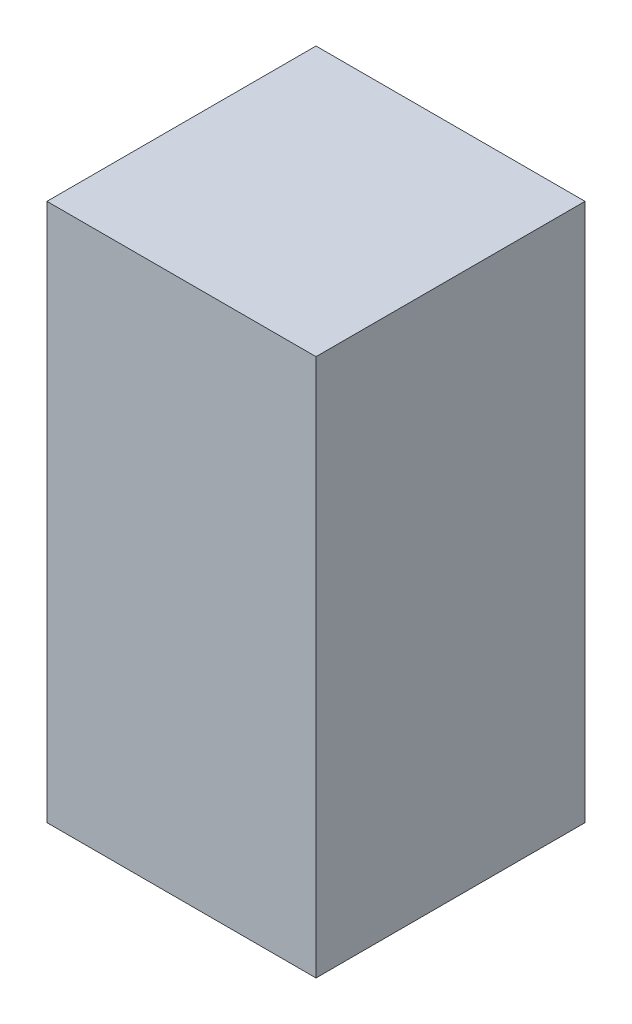
ISO-10303-21;
HEADER;
FILE_DESCRIPTION(('STEP AP214'),'2;1');
FILE_NAME('part.step','',(''),(''),'','','');
FILE_SCHEMA(('AUTOMOTIVE_DESIGN { 1 0 10303 214 1 1 1 1 }'));
ENDSEC;
DATA;
#1=APPLICATION_CONTEXT('core data for automotive mechanical design processes');
#2=APPLICATION_PROTOCOL_DEFINITION('international standard','automotive_design',2000,#1);
#3=PRODUCT_CONTEXT('',#1,'mechanical');
#4=PRODUCT('Part','Part','',(#3));
#5=PRODUCT_RELATED_PRODUCT_CATEGORY('part','',(#4));
#6=PRODUCT_DEFINITION_FORMATION('','',#4);
#7=PRODUCT_DEFINITION_CONTEXT('part definition',#1,'design');
#8=PRODUCT_DEFINITION('design','',#6,#7);
#9=PRODUCT_DEFINITION_SHAPE('','',#8);
#10=(LENGTH_UNIT() NAMED_UNIT(*) SI_UNIT(.MILLI.,.METRE.));
#11=(NAMED_UNIT(*) PLANE_ANGLE_UNIT() SI_UNIT($,.RADIAN.));
#12=(NAMED_UNIT(*) SI_UNIT($,.STERADIAN.) SOLID_ANGLE_UNIT());
#13=UNCERTAINTY_MEASURE_WITH_UNIT(LENGTH_MEASURE(1.E-05),#10,'distance_accuracy_value','');
#14=(GEOMETRIC_REPRESENTATION_CONTEXT(3) GLOBAL_UNCERTAINTY_ASSIGNED_CONTEXT((#13)) GLOBAL_UNIT_ASSIGNED_CONTEXT((#10,
#11,#12)) REPRESENTATION_CONTEXT('',''));
#15=CARTESIAN_POINT('',(0.,0.,0.));
#16=DIRECTION('',(0.,0.,1.));
#17=DIRECTION('',(1.,0.,0.));
#18=AXIS2_PLACEMENT_3D('',#15,#16,#17);
#19=CARTESIAN_POINT('',(50.,200.,50.));
#20=DIRECTION('',(-1.,0.,0.));
#21=DIRECTION('',(0.,0.,1.));
#22=AXIS2_PLACEMENT_3D('',#19,#20,#21);
#23=PLANE('',#22);
#24=DIRECTION('',(0.,0.,-1.));
#25=VECTOR('',#24,1.);
#26=CARTESIAN_POINT('',(50.,0.,50.));
#27=LINE('',#26,#25);
#28=CARTESIAN_POINT('',(50.,0.,50.));
#29=VERTEX_POINT('',#28);
#30=CARTESIAN_POINT('',(50.,0.,-50.));
#31=VERTEX_POINT('',#30);
#32=EDGE_CURVE('E97',#29,#31,#27,.T.);
#33=ORIENTED_EDGE('',*,*,#32,.T.);
#34=DIRECTION('',(0.,-1.,0.));
#35=VECTOR('',#34,1.);
#36=CARTESIAN_POINT('',(50.,200.,-50.));
#37=LINE('',#36,#35);
#38=CARTESIAN_POINT('',(50.,200.,-50.));
#39=VERTEX_POINT('',#38);
#40=EDGE_CURVE('E11',#39,#31,#37,.T.);
#41=ORIENTED_EDGE('',*,*,#40,.F.);
#42=DIRECTION('',(0.,0.,-1.));
#43=VECTOR('',#42,1.);
#44=CARTESIAN_POINT('',(50.,200.,50.));
#45=LINE('',#44,#43);
#46=CARTESIAN_POINT('',(50.,200.,50.));
#47=VERTEX_POINT('',#46);
#48=EDGE_CURVE('E85',#47,#39,#45,.T.);
#49=ORIENTED_EDGE('',*,*,#48,.F.);
#50=DIRECTION('',(0.,-1.,0.));
#51=VECTOR('',#50,1.);
#52=CARTESIAN_POINT('',(50.,200.,50.));
#53=LINE('',#52,#51);
#54=EDGE_CURVE('E93',#47,#29,#53,.T.);
#55=ORIENTED_EDGE('',*,*,#54,.T.);
#56=EDGE_LOOP('',(#33,#41,#49,#55));
#57=FACE_BOUND('',#56,.T.);
#58=ADVANCED_FACE('F34',(#57),#23,.F.);
#59=CARTESIAN_POINT('',(-50.,200.,-50.));
#60=DIRECTION('',(0.,0.,1.));
#61=DIRECTION('',(1.,0.,0.));
#62=AXIS2_PLACEMENT_3D('',#59,#60,#61);
#63=PLANE('',#62);
#64=DIRECTION('',(-1.,0.,0.));
#65=VECTOR('',#64,1.);
#66=CARTESIAN_POINT('',(-50.,0.,-50.));
#67=LINE('',#66,#65);
#68=CARTESIAN_POINT('',(-50.,0.,-50.));
#69=VERTEX_POINT('',#68);
#70=EDGE_CURVE('E89',#31,#69,#67,.T.);
#71=ORIENTED_EDGE('',*,*,#70,.T.);
#72=DIRECTION('',(0.,-1.,0.));
#73=VECTOR('',#72,1.);
#74=CARTESIAN_POINT('',(-50.,200.,-50.));
#75=LINE('',#74,#73);
#76=CARTESIAN_POINT('',(-50.,200.,-50.));
#77=VERTEX_POINT('',#76);
#78=EDGE_CURVE('E42',#77,#69,#75,.T.);
#79=ORIENTED_EDGE('',*,*,#78,.F.);
#80=DIRECTION('',(-1.,0.,0.));
#81=VECTOR('',#80,1.);
#82=CARTESIAN_POINT('',(-50.,200.,-50.));
#83=LINE('',#82,#81);
#84=EDGE_CURVE('E80',#39,#77,#83,.T.);
#85=ORIENTED_EDGE('',*,*,#84,.F.);
#86=ORIENTED_EDGE('',*,*,#40,.T.);
#87=EDGE_LOOP('',(#71,#79,#85,#86));
#88=FACE_BOUND('',#87,.T.);
#89=ADVANCED_FACE('F88',(#88),#63,.F.);
#90=CARTESIAN_POINT('',(-50.,200.,50.));
#91=DIRECTION('',(1.,0.,0.));
#92=DIRECTION('',(0.,0.,-1.));
#93=AXIS2_PLACEMENT_3D('',#90,#91,#92);
#94=PLANE('',#93);
#95=DIRECTION('',(0.,0.,1.));
#96=VECTOR('',#95,1.);
#97=CARTESIAN_POINT('',(-50.,0.,50.));
#98=LINE('',#97,#96);
#99=CARTESIAN_POINT('',(-50.,0.,50.));
#100=VERTEX_POINT('',#99);
#101=EDGE_CURVE('E67',#69,#100,#98,.T.);
#102=ORIENTED_EDGE('',*,*,#101,.T.);
#103=DIRECTION('',(0.,-1.,0.));
#104=VECTOR('',#103,1.);
#105=CARTESIAN_POINT('',(-50.,200.,50.));
#106=LINE('',#105,#104);
#107=CARTESIAN_POINT('',(-50.,200.,50.));
#108=VERTEX_POINT('',#107);
#109=EDGE_CURVE('E90',#108,#100,#106,.T.);
#110=ORIENTED_EDGE('',*,*,#109,.F.);
#111=DIRECTION('',(0.,0.,1.));
#112=VECTOR('',#111,1.);
#113=CARTESIAN_POINT('',(-50.,200.,50.));
#114=LINE('',#113,#112);
#115=EDGE_CURVE('E83',#77,#108,#114,.T.);
#116=ORIENTED_EDGE('',*,*,#115,.F.);
#117=ORIENTED_EDGE('',*,*,#78,.T.);
#118=EDGE_LOOP('',(#102,#110,#116,#117));
#119=FACE_BOUND('',#118,.T.);
#120=ADVANCED_FACE('F91',(#119),#94,.F.);
#121=CARTESIAN_POINT('',(-50.,200.,50.));
#122=DIRECTION('',(0.,0.,-1.));
#123=DIRECTION('',(-1.,0.,0.));
#124=AXIS2_PLACEMENT_3D('',#121,#122,#123);
#125=PLANE('',#124);
#126=DIRECTION('',(1.,0.,0.));
#127=VECTOR('',#126,1.);
#128=CARTESIAN_POINT('',(-50.,0.,50.));
#129=LINE('',#128,#127);
#130=EDGE_CURVE('E73',#100,#29,#129,.T.);
#131=ORIENTED_EDGE('',*,*,#130,.T.);
#132=ORIENTED_EDGE('',*,*,#54,.F.);
#133=DIRECTION('',(1.,0.,0.));
#134=VECTOR('',#133,1.);
#135=CARTESIAN_POINT('',(-50.,200.,50.));
#136=LINE('',#135,#134);
#137=EDGE_CURVE('E50',#108,#47,#136,.T.);
#138=ORIENTED_EDGE('',*,*,#137,.F.);
#139=ORIENTED_EDGE('',*,*,#109,.T.);
#140=EDGE_LOOP('',(#131,#132,#138,#139));
#141=FACE_BOUND('',#140,.T.);
#142=ADVANCED_FACE('F104',(#141),#125,.F.);
#143=CARTESIAN_POINT('',(0.,200.,0.));
#144=DIRECTION('',(0.,-1.,0.));
#145=DIRECTION('',(0.,0.,-1.));
#146=AXIS2_PLACEMENT_3D('',#143,#144,#145);
#147=PLANE('',#146);
#148=ORIENTED_EDGE('',*,*,#48,.T.);
#149=ORIENTED_EDGE('',*,*,#84,.T.);
#150=ORIENTED_EDGE('',*,*,#115,.T.);
#151=ORIENTED_EDGE('',*,*,#137,.T.);
#152=EDGE_LOOP('',(#148,#149,#150,#151));
#153=FACE_BOUND('',#152,.T.);
#154=ADVANCED_FACE('F81',(#153),#147,.F.);
#155=CARTESIAN_POINT('',(0.,0.,0.));
#156=DIRECTION('',(0.,-1.,0.));
#157=DIRECTION('',(0.,0.,-1.));
#158=AXIS2_PLACEMENT_3D('',#155,#156,#157);
#159=PLANE('',#158);
#160=ORIENTED_EDGE('',*,*,#32,.F.);
#161=ORIENTED_EDGE('',*,*,#130,.F.);
#162=ORIENTED_EDGE('',*,*,#101,.F.);
#163=ORIENTED_EDGE('',*,*,#70,.F.);
#164=EDGE_LOOP('',(#160,#161,#162,#163));
#165=FACE_BOUND('',#164,.T.);
#166=ADVANCED_FACE('F107',(#165),#159,.T.);
#167=CLOSED_SHELL('',(#58,#89,#120,#142,#154,#166));
#168=MANIFOLD_SOLID_BREP('B2',#167);
#169=ADVANCED_BREP_SHAPE_REPRESENTATION('',(#18,#168),#14);
#170=SHAPE_DEFINITION_REPRESENTATION(#9,#169);
ENDSEC;
END-ISO-10303-21;
